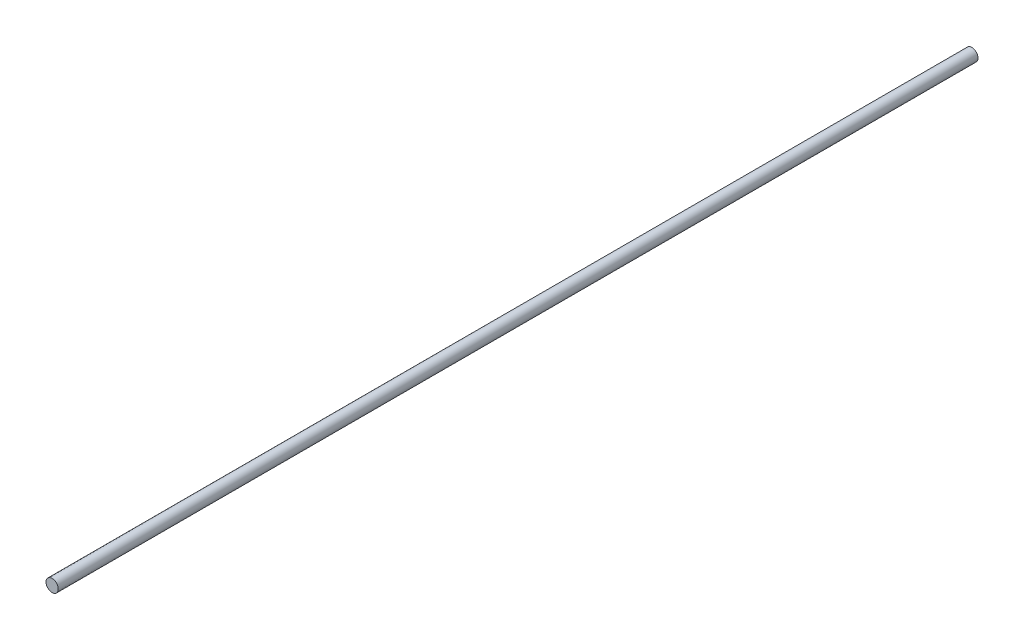
ISO-10303-21;
HEADER;
FILE_DESCRIPTION(('STEP AP214'),'2;1');
FILE_NAME('part.step','',(''),(''),'','','');
FILE_SCHEMA(('AUTOMOTIVE_DESIGN { 1 0 10303 214 1 1 1 1 }'));
ENDSEC;
DATA;
#1=APPLICATION_CONTEXT('core data for automotive mechanical design processes');
#2=APPLICATION_PROTOCOL_DEFINITION('international standard','automotive_design',2000,#1);
#3=PRODUCT_CONTEXT('',#1,'mechanical');
#4=PRODUCT('Part','Part','',(#3));
#5=PRODUCT_RELATED_PRODUCT_CATEGORY('part','',(#4));
#6=PRODUCT_DEFINITION_FORMATION('','',#4);
#7=PRODUCT_DEFINITION_CONTEXT('part definition',#1,'design');
#8=PRODUCT_DEFINITION('design','',#6,#7);
#9=PRODUCT_DEFINITION_SHAPE('','',#8);
#10=(LENGTH_UNIT() NAMED_UNIT(*) SI_UNIT(.MILLI.,.METRE.));
#11=(NAMED_UNIT(*) PLANE_ANGLE_UNIT() SI_UNIT($,.RADIAN.));
#12=(NAMED_UNIT(*) SI_UNIT($,.STERADIAN.) SOLID_ANGLE_UNIT());
#13=UNCERTAINTY_MEASURE_WITH_UNIT(LENGTH_MEASURE(1.E-05),#10,'distance_accuracy_value','');
#14=(GEOMETRIC_REPRESENTATION_CONTEXT(3) GLOBAL_UNCERTAINTY_ASSIGNED_CONTEXT((#13)) GLOBAL_UNIT_ASSIGNED_CONTEXT((#10,
#11,#12)) REPRESENTATION_CONTEXT('',''));
#15=CARTESIAN_POINT('',(0.,0.,0.));
#16=DIRECTION('',(0.,0.,1.));
#17=DIRECTION('',(1.,0.,0.));
#18=AXIS2_PLACEMENT_3D('',#15,#16,#17);
#19=CARTESIAN_POINT('',(0.,0.,600.));
#20=DIRECTION('',(0.,0.,-1.));
#21=DIRECTION('',(-1.,0.,0.));
#22=AXIS2_PLACEMENT_3D('',#19,#20,#21);
#23=CYLINDRICAL_SURFACE('',#22,4.);
#24=CARTESIAN_POINT('',(0.,0.,600.));
#25=DIRECTION('',(0.,0.,1.));
#26=DIRECTION('',(1.,0.,0.));
#27=AXIS2_PLACEMENT_3D('',#24,#25,#26);
#28=CIRCLE('',#27,4.);
#29=CARTESIAN_POINT('',(4.,0.,600.));
#30=VERTEX_POINT('',#29);
#31=EDGE_CURVE('E10',#30,#30,#28,.T.);
#32=ORIENTED_EDGE('',*,*,#31,.F.);
#33=EDGE_LOOP('',(#32));
#34=FACE_BOUND('',#33,.T.);
#35=CARTESIAN_POINT('',(0.,0.,0.));
#36=DIRECTION('',(0.,0.,1.));
#37=DIRECTION('',(1.,0.,0.));
#38=AXIS2_PLACEMENT_3D('',#35,#36,#37);
#39=CIRCLE('',#38,4.);
#40=CARTESIAN_POINT('',(4.,0.,0.));
#41=VERTEX_POINT('',#40);
#42=EDGE_CURVE('E40',#41,#41,#39,.T.);
#43=ORIENTED_EDGE('',*,*,#42,.T.);
#44=EDGE_LOOP('',(#43));
#45=FACE_BOUND('',#44,.T.);
#46=ADVANCED_FACE('F37',(#34,#45),#23,.T.);
#47=CARTESIAN_POINT('',(0.,0.,600.));
#48=DIRECTION('',(0.,0.,1.));
#49=DIRECTION('',(1.,0.,0.));
#50=AXIS2_PLACEMENT_3D('',#47,#48,#49);
#51=PLANE('',#50);
#52=ORIENTED_EDGE('',*,*,#31,.T.);
#53=EDGE_LOOP('',(#52));
#54=FACE_BOUND('',#53,.T.);
#55=ADVANCED_FACE('F52',(#54),#51,.T.);
#56=CARTESIAN_POINT('',(0.,0.,0.));
#57=DIRECTION('',(0.,0.,1.));
#58=DIRECTION('',(1.,0.,0.));
#59=AXIS2_PLACEMENT_3D('',#56,#57,#58);
#60=PLANE('',#59);
#61=ORIENTED_EDGE('',*,*,#42,.F.);
#62=EDGE_LOOP('',(#61));
#63=FACE_BOUND('',#62,.T.);
#64=ADVANCED_FACE('F50',(#63),#60,.F.);
#65=CLOSED_SHELL('',(#46,#55,#64));
#66=MANIFOLD_SOLID_BREP('B2',#65);
#67=ADVANCED_BREP_SHAPE_REPRESENTATION('',(#18,#66),#14);
#68=SHAPE_DEFINITION_REPRESENTATION(#9,#67);
ENDSEC;
END-ISO-10303-21;
